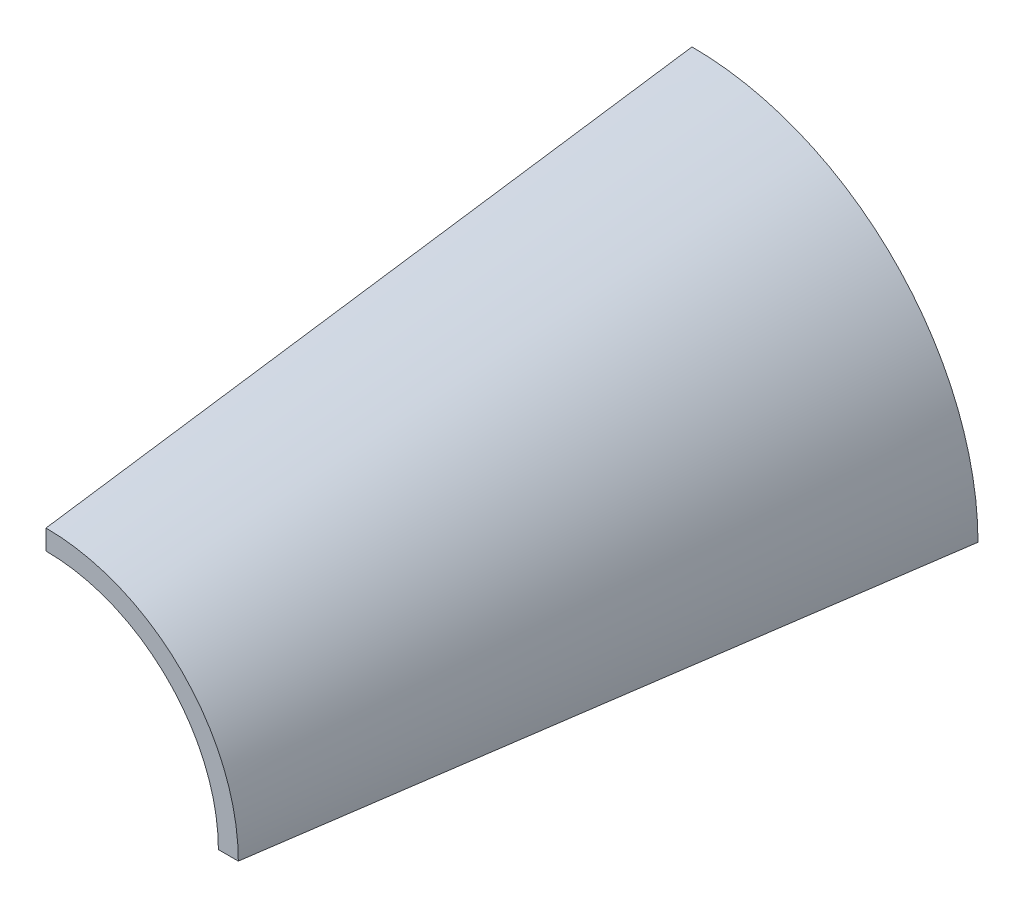
ISO-10303-21;
HEADER;
FILE_DESCRIPTION(('STEP AP214'),'2;1');
FILE_NAME('part.step','',(''),(''),'','','');
FILE_SCHEMA(('AUTOMOTIVE_DESIGN { 1 0 10303 214 1 1 1 1 }'));
ENDSEC;
DATA;
#1=APPLICATION_CONTEXT('core data for automotive mechanical design processes');
#2=APPLICATION_PROTOCOL_DEFINITION('international standard','automotive_design',2000,#1);
#3=PRODUCT_CONTEXT('',#1,'mechanical');
#4=PRODUCT('Part','Part','',(#3));
#5=PRODUCT_RELATED_PRODUCT_CATEGORY('part','',(#4));
#6=PRODUCT_DEFINITION_FORMATION('','',#4);
#7=PRODUCT_DEFINITION_CONTEXT('part definition',#1,'design');
#8=PRODUCT_DEFINITION('design','',#6,#7);
#9=PRODUCT_DEFINITION_SHAPE('','',#8);
#10=(LENGTH_UNIT() NAMED_UNIT(*) SI_UNIT(.MILLI.,.METRE.));
#11=(NAMED_UNIT(*) PLANE_ANGLE_UNIT() SI_UNIT($,.RADIAN.));
#12=(NAMED_UNIT(*) SI_UNIT($,.STERADIAN.) SOLID_ANGLE_UNIT());
#13=UNCERTAINTY_MEASURE_WITH_UNIT(LENGTH_MEASURE(1.E-05),#10,'distance_accuracy_value','');
#14=(GEOMETRIC_REPRESENTATION_CONTEXT(3) GLOBAL_UNCERTAINTY_ASSIGNED_CONTEXT((#13)) GLOBAL_UNIT_ASSIGNED_CONTEXT((#10,
#11,#12)) REPRESENTATION_CONTEXT('',''));
#15=CARTESIAN_POINT('',(0.,0.,0.));
#16=DIRECTION('',(0.,0.,1.));
#17=DIRECTION('',(1.,0.,0.));
#18=AXIS2_PLACEMENT_3D('',#15,#16,#17);
#19=CARTESIAN_POINT('',(0.,0.,6550.));
#20=DIRECTION('',(0.,0.,-1.));
#21=DIRECTION('',(-1.,0.,0.));
#22=AXIS2_PLACEMENT_3D('',#19,#20,#21);
#23=PLANE('',#22);
#24=CARTESIAN_POINT('',(0.,0.,6550.));
#25=DIRECTION('',(0.,0.,1.));
#26=DIRECTION('',(1.,0.,0.));
#27=AXIS2_PLACEMENT_3D('',#24,#25,#26);
#28=CIRCLE('',#27,1747.90734103792);
#29=CARTESIAN_POINT('',(1747.90734103792,-6.10278586326082E-12,6550.));
#30=VERTEX_POINT('',#29);
#31=CARTESIAN_POINT('',(0.,1747.90734103792,6550.));
#32=VERTEX_POINT('',#31);
#33=EDGE_CURVE('E11',#30,#32,#28,.T.);
#34=ORIENTED_EDGE('',*,*,#33,.F.);
#35=DIRECTION('',(-1.,0.,0.));
#36=VECTOR('',#35,1.);
#37=CARTESIAN_POINT('',(0.,0.,6550.));
#38=LINE('',#37,#36);
#39=CARTESIAN_POINT('',(1950.,-6.80838861074411E-12,6550.));
#40=VERTEX_POINT('',#39);
#41=EDGE_CURVE('E98',#40,#30,#38,.T.);
#42=ORIENTED_EDGE('',*,*,#41,.F.);
#43=CARTESIAN_POINT('',(0.,0.,6550.));
#44=DIRECTION('',(0.,0.,1.));
#45=DIRECTION('',(1.,0.,0.));
#46=AXIS2_PLACEMENT_3D('',#43,#44,#45);
#47=CIRCLE('',#46,1950.);
#48=CARTESIAN_POINT('',(0.,1950.,6550.));
#49=VERTEX_POINT('',#48);
#50=EDGE_CURVE('E51',#40,#49,#47,.T.);
#51=ORIENTED_EDGE('',*,*,#50,.T.);
#52=DIRECTION('',(0.,-1.,0.));
#53=VECTOR('',#52,1.);
#54=CARTESIAN_POINT('',(0.,0.,6550.));
#55=LINE('',#54,#53);
#56=EDGE_CURVE('E87',#49,#32,#55,.T.);
#57=ORIENTED_EDGE('',*,*,#56,.T.);
#58=EDGE_LOOP('',(#34,#42,#51,#57));
#59=FACE_BOUND('',#58,.T.);
#60=ADVANCED_FACE('F36',(#59),#23,.F.);
#61=CARTESIAN_POINT('',(0.,0.,6550.));
#62=DIRECTION('',(0.,0.,-1.));
#63=DIRECTION('',(-1.,0.,0.));
#64=AXIS2_PLACEMENT_3D('',#61,#62,#63);
#65=CONICAL_SURFACE('',#64,1747.90734103792,0.144033803488995);
#66=CARTESIAN_POINT('',(0.,0.,0.));
#67=DIRECTION('',(0.,0.,1.));
#68=DIRECTION('',(1.,0.,0.));
#69=AXIS2_PLACEMENT_3D('',#66,#67,#68);
#70=CIRCLE('',#69,2697.90734103792);
#71=CARTESIAN_POINT('',(2697.90734103792,-9.4196931351618E-12,0.));
#72=VERTEX_POINT('',#71);
#73=CARTESIAN_POINT('',(0.,2697.90734103792,0.));
#74=VERTEX_POINT('',#73);
#75=EDGE_CURVE('E44',#72,#74,#70,.T.);
#76=ORIENTED_EDGE('',*,*,#75,.F.);
#77=DIRECTION('',(0.14353630526099,0.,-0.989645052062619));
#78=VECTOR('',#77,1.);
#79=CARTESIAN_POINT('',(2642.32324389635,-9.22562229725554E-12,383.23772239718));
#80=LINE('',#79,#78);
#81=EDGE_CURVE('E83',#30,#72,#80,.T.);
#82=ORIENTED_EDGE('',*,*,#81,.F.);
#83=ORIENTED_EDGE('',*,*,#33,.T.);
#84=DIRECTION('',(0.,0.14353630526099,-0.989645052062619));
#85=VECTOR('',#84,1.);
#86=CARTESIAN_POINT('',(0.,2642.32324389635,383.23772239718));
#87=LINE('',#86,#85);
#88=EDGE_CURVE('E80',#32,#74,#87,.T.);
#89=ORIENTED_EDGE('',*,*,#88,.T.);
#90=EDGE_LOOP('',(#76,#82,#83,#89));
#91=FACE_BOUND('',#90,.T.);
#92=ADVANCED_FACE('F38',(#91),#65,.F.);
#93=CARTESIAN_POINT('',(0.,0.,0.));
#94=DIRECTION('',(0.,0.,1.));
#95=DIRECTION('',(1.,0.,0.));
#96=AXIS2_PLACEMENT_3D('',#93,#94,#95);
#97=PLANE('',#96);
#98=CARTESIAN_POINT('',(0.,0.,0.));
#99=DIRECTION('',(0.,0.,1.));
#100=DIRECTION('',(1.,0.,0.));
#101=AXIS2_PLACEMENT_3D('',#98,#99,#100);
#102=CIRCLE('',#101,2900.);
#103=CARTESIAN_POINT('',(2900.,-1.01252958826451E-11,0.));
#104=VERTEX_POINT('',#103);
#105=CARTESIAN_POINT('',(0.,2900.,0.));
#106=VERTEX_POINT('',#105);
#107=EDGE_CURVE('E59',#104,#106,#102,.T.);
#108=ORIENTED_EDGE('',*,*,#107,.F.);
#109=DIRECTION('',(1.,0.,0.));
#110=VECTOR('',#109,1.);
#111=CARTESIAN_POINT('',(0.,0.,0.));
#112=LINE('',#111,#110);
#113=EDGE_CURVE('E101',#72,#104,#112,.T.);
#114=ORIENTED_EDGE('',*,*,#113,.F.);
#115=ORIENTED_EDGE('',*,*,#75,.T.);
#116=DIRECTION('',(0.,1.,0.));
#117=VECTOR('',#116,1.);
#118=CARTESIAN_POINT('',(0.,0.,0.));
#119=LINE('',#118,#117);
#120=EDGE_CURVE('E92',#74,#106,#119,.T.);
#121=ORIENTED_EDGE('',*,*,#120,.T.);
#122=EDGE_LOOP('',(#108,#114,#115,#121));
#123=FACE_BOUND('',#122,.T.);
#124=ADVANCED_FACE('F107',(#123),#97,.F.);
#125=CARTESIAN_POINT('',(0.,0.,0.));
#126=DIRECTION('',(0.,0.,-1.));
#127=DIRECTION('',(-1.,0.,0.));
#128=AXIS2_PLACEMENT_3D('',#125,#126,#127);
#129=CONICAL_SURFACE('',#128,2900.,0.144033803488995);
#130=DIRECTION('',(-0.143536305260991,0.,0.989645052062619));
#131=VECTOR('',#130,1.);
#132=CARTESIAN_POINT('',(2840.25225430887,-9.91668774352656E-12,411.944983449378));
#133=LINE('',#132,#131);
#134=EDGE_CURVE('E103',#104,#40,#133,.T.);
#135=ORIENTED_EDGE('',*,*,#134,.F.);
#136=ORIENTED_EDGE('',*,*,#107,.T.);
#137=DIRECTION('',(0.,-0.143536305260991,0.989645052062619));
#138=VECTOR('',#137,1.);
#139=CARTESIAN_POINT('',(0.,2840.25225430887,411.944983449378));
#140=LINE('',#139,#138);
#141=EDGE_CURVE('E94',#106,#49,#140,.T.);
#142=ORIENTED_EDGE('',*,*,#141,.T.);
#143=ORIENTED_EDGE('',*,*,#50,.F.);
#144=EDGE_LOOP('',(#135,#136,#142,#143));
#145=FACE_BOUND('',#144,.T.);
#146=ADVANCED_FACE('F110',(#145),#129,.T.);
#147=CARTESIAN_POINT('',(0.,0.,0.));
#148=DIRECTION('',(0.,-1.,0.));
#149=DIRECTION('',(0.,0.,-1.));
#150=AXIS2_PLACEMENT_3D('',#147,#148,#149);
#151=PLANE('',#150);
#152=ORIENTED_EDGE('',*,*,#41,.T.);
#153=ORIENTED_EDGE('',*,*,#81,.T.);
#154=ORIENTED_EDGE('',*,*,#113,.T.);
#155=ORIENTED_EDGE('',*,*,#134,.T.);
#156=EDGE_LOOP('',(#152,#153,#154,#155));
#157=FACE_BOUND('',#156,.T.);
#158=ADVANCED_FACE('F109',(#157),#151,.T.);
#159=CARTESIAN_POINT('',(0.,0.,0.));
#160=DIRECTION('',(1.,0.,0.));
#161=DIRECTION('',(0.,0.,-1.));
#162=AXIS2_PLACEMENT_3D('',#159,#160,#161);
#163=PLANE('',#162);
#164=ORIENTED_EDGE('',*,*,#56,.F.);
#165=ORIENTED_EDGE('',*,*,#141,.F.);
#166=ORIENTED_EDGE('',*,*,#120,.F.);
#167=ORIENTED_EDGE('',*,*,#88,.F.);
#168=EDGE_LOOP('',(#164,#165,#166,#167));
#169=FACE_BOUND('',#168,.T.);
#170=ADVANCED_FACE('F91',(#169),#163,.F.);
#171=CLOSED_SHELL('',(#60,#92,#124,#146,#158,#170));
#172=MANIFOLD_SOLID_BREP('B2',#171);
#173=ADVANCED_BREP_SHAPE_REPRESENTATION('',(#18,#172),#14);
#174=SHAPE_DEFINITION_REPRESENTATION(#9,#173);
ENDSEC;
END-ISO-10303-21;
